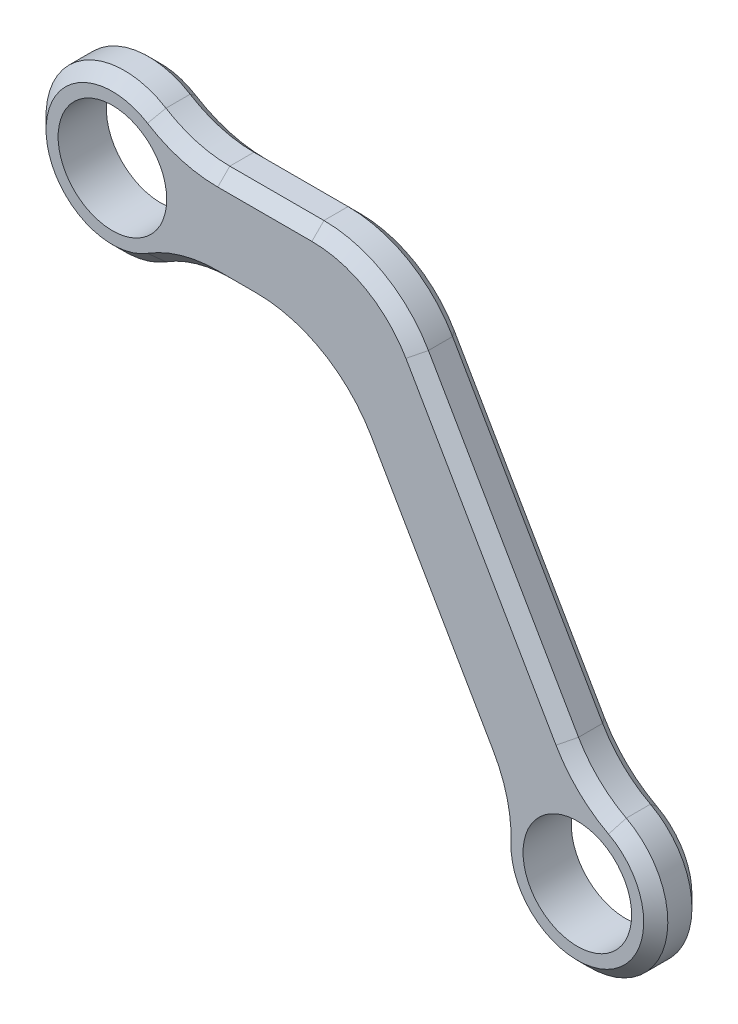
ISO-10303-21;
HEADER;
FILE_DESCRIPTION(('STEP AP214'),'2;1');
FILE_NAME('part.step','',(''),(''),'','','');
FILE_SCHEMA(('AUTOMOTIVE_DESIGN { 1 0 10303 214 1 1 1 1 }'));
ENDSEC;
DATA;
#1=APPLICATION_CONTEXT('core data for automotive mechanical design processes');
#2=APPLICATION_PROTOCOL_DEFINITION('international standard','automotive_design',2000,#1);
#3=PRODUCT_CONTEXT('',#1,'mechanical');
#4=PRODUCT('Part','Part','',(#3));
#5=PRODUCT_RELATED_PRODUCT_CATEGORY('part','',(#4));
#6=PRODUCT_DEFINITION_FORMATION('','',#4);
#7=PRODUCT_DEFINITION_CONTEXT('part definition',#1,'design');
#8=PRODUCT_DEFINITION('design','',#6,#7);
#9=PRODUCT_DEFINITION_SHAPE('','',#8);
#10=(LENGTH_UNIT() NAMED_UNIT(*) SI_UNIT(.MILLI.,.METRE.));
#11=(NAMED_UNIT(*) PLANE_ANGLE_UNIT() SI_UNIT($,.RADIAN.));
#12=(NAMED_UNIT(*) SI_UNIT($,.STERADIAN.) SOLID_ANGLE_UNIT());
#13=UNCERTAINTY_MEASURE_WITH_UNIT(LENGTH_MEASURE(1.E-05),#10,'distance_accuracy_value','');
#14=(GEOMETRIC_REPRESENTATION_CONTEXT(3) GLOBAL_UNCERTAINTY_ASSIGNED_CONTEXT((#13)) GLOBAL_UNIT_ASSIGNED_CONTEXT((#10,
#11,#12)) REPRESENTATION_CONTEXT('',''));
#15=CARTESIAN_POINT('',(0.,0.,0.));
#16=DIRECTION('',(0.,0.,1.));
#17=DIRECTION('',(1.,0.,0.));
#18=AXIS2_PLACEMENT_3D('',#15,#16,#17);
#19=CARTESIAN_POINT('',(38.5373405464593,-32.1076156636743,-4.));
#20=DIRECTION('',(0.,0.,-1.));
#21=DIRECTION('',(1.,0.,0.));
#22=AXIS2_PLACEMENT_3D('',#19,#20,#21);
#23=PLANE('',#22);
#24=CARTESIAN_POINT('',(38.5373405464593,-32.1076156636743,-4.));
#25=DIRECTION('',(0.,0.,1.));
#26=DIRECTION('',(1.,0.,0.));
#27=AXIS2_PLACEMENT_3D('',#24,#25,#26);
#28=CIRCLE('',#27,5.5);
#29=CARTESIAN_POINT('',(33.0405345624175,-31.9202017532986,-4.));
#30=VERTEX_POINT('',#29);
#31=CARTESIAN_POINT('',(41.1234383310723,-27.2535350866319,-4.));
#32=VERTEX_POINT('',#31);
#33=EDGE_CURVE('E54',#30,#32,#28,.T.);
#34=ORIENTED_EDGE('',*,*,#33,.F.);
#35=CARTESIAN_POINT('',(22.0469225943339,-31.5453739325472,-4.));
#36=DIRECTION('',(0.,0.,1.));
#37=DIRECTION('',(1.,0.,0.));
#38=AXIS2_PLACEMENT_3D('',#35,#36,#37);
#39=CIRCLE('',#38,11.);
#40=CARTESIAN_POINT('',(31.5732020359628,-26.0453739325472,-4.));
#41=VERTEX_POINT('',#40);
#42=EDGE_CURVE('E388',#41,#30,#39,.F.);
#43=ORIENTED_EDGE('',*,*,#42,.F.);
#44=DIRECTION('',(0.499999999999998,-0.86602540378444,0.));
#45=VECTOR('',#44,1.);
#46=CARTESIAN_POINT('',(31.5732020359628,-26.0453739325472,-4.));
#47=LINE('',#46,#45);
#48=CARTESIAN_POINT('',(21.4433756729741,-8.50000000000002,-4.));
#49=VERTEX_POINT('',#48);
#50=EDGE_CURVE('E385',#49,#41,#47,.T.);
#51=ORIENTED_EDGE('',*,*,#50,.F.);
#52=CARTESIAN_POINT('',(11.9170962313452,-14.,-4.));
#53=DIRECTION('',(0.,0.,1.));
#54=DIRECTION('',(1.,0.,0.));
#55=AXIS2_PLACEMENT_3D('',#52,#53,#54);
#56=CIRCLE('',#55,11.);
#57=CARTESIAN_POINT('',(11.9170962313452,-3.,-4.));
#58=VERTEX_POINT('',#57);
#59=EDGE_CURVE('E382',#58,#49,#56,.F.);
#60=ORIENTED_EDGE('',*,*,#59,.F.);
#61=DIRECTION('',(1.,0.,0.));
#62=VECTOR('',#61,1.);
#63=CARTESIAN_POINT('',(11.9170962313452,-3.,-4.));
#64=LINE('',#63,#62);
#65=CARTESIAN_POINT('',(8.73212459828649,-3.,-4.));
#66=VERTEX_POINT('',#65);
#67=EDGE_CURVE('E379',#66,#58,#64,.T.);
#68=ORIENTED_EDGE('',*,*,#67,.F.);
#69=CARTESIAN_POINT('',(8.73212459828649,-14.,-4.));
#70=DIRECTION('',(0.,0.,1.));
#71=DIRECTION('',(1.,0.,0.));
#72=AXIS2_PLACEMENT_3D('',#69,#70,#71);
#73=CIRCLE('',#72,11.);
#74=CARTESIAN_POINT('',(2.91070819942883,-4.66666666666667,-4.));
#75=VERTEX_POINT('',#74);
#76=EDGE_CURVE('E376',#75,#66,#73,.F.);
#77=ORIENTED_EDGE('',*,*,#76,.F.);
#78=CARTESIAN_POINT('',(0.,0.,-4.));
#79=DIRECTION('',(0.,0.,1.));
#80=DIRECTION('',(1.,0.,0.));
#81=AXIS2_PLACEMENT_3D('',#78,#79,#80);
#82=CIRCLE('',#81,5.5);
#83=CARTESIAN_POINT('',(2.91070819942883,4.66666666666667,-4.));
#84=VERTEX_POINT('',#83);
#85=EDGE_CURVE('E373',#84,#75,#82,.T.);
#86=ORIENTED_EDGE('',*,*,#85,.F.);
#87=CARTESIAN_POINT('',(8.73212459828649,14.,-4.));
#88=DIRECTION('',(0.,0.,1.));
#89=DIRECTION('',(1.,0.,0.));
#90=AXIS2_PLACEMENT_3D('',#87,#88,#89);
#91=CIRCLE('',#90,11.);
#92=CARTESIAN_POINT('',(8.73212459828649,3.,-4.));
#93=VERTEX_POINT('',#92);
#94=EDGE_CURVE('E370',#93,#84,#91,.F.);
#95=ORIENTED_EDGE('',*,*,#94,.F.);
#96=DIRECTION('',(-1.,0.,0.));
#97=VECTOR('',#96,1.);
#98=CARTESIAN_POINT('',(8.73212459828649,3.,-4.));
#99=LINE('',#98,#97);
#100=CARTESIAN_POINT('',(16.5358983848622,3.,-4.));
#101=VERTEX_POINT('',#100);
#102=EDGE_CURVE('E368',#101,#93,#99,.T.);
#103=ORIENTED_EDGE('',*,*,#102,.F.);
#104=CARTESIAN_POINT('',(16.5358983848622,-6.,-4.));
#105=DIRECTION('',(0.,0.,1.));
#106=DIRECTION('',(1.,0.,0.));
#107=AXIS2_PLACEMENT_3D('',#104,#105,#106);
#108=CIRCLE('',#107,9.);
#109=CARTESIAN_POINT('',(24.3301270189222,-1.50000000000002,-4.));
#110=VERTEX_POINT('',#109);
#111=EDGE_CURVE('E215',#110,#101,#108,.T.);
#112=ORIENTED_EDGE('',*,*,#111,.F.);
#113=DIRECTION('',(-0.499999999999998,0.86602540378444,0.));
#114=VECTOR('',#113,1.);
#115=CARTESIAN_POINT('',(24.3301270189222,-1.50000000000002,-4.));
#116=LINE('',#115,#114);
#117=CARTESIAN_POINT('',(36.7693544586694,-23.0453739325472,-4.));
#118=VERTEX_POINT('',#117);
#119=EDGE_CURVE('E364',#118,#110,#116,.T.);
#120=ORIENTED_EDGE('',*,*,#119,.F.);
#121=CARTESIAN_POINT('',(46.2956339002982,-17.5453739325472,-4.));
#122=DIRECTION('',(0.,0.,1.));
#123=DIRECTION('',(1.,0.,0.));
#124=AXIS2_PLACEMENT_3D('',#121,#122,#123);
#125=CIRCLE('',#124,11.);
#126=EDGE_CURVE('E11',#32,#118,#125,.F.);
#127=ORIENTED_EDGE('',*,*,#126,.F.);
#128=EDGE_LOOP('',(#34,#43,#51,#60,#68,#77,#86,#95,#103,#112,#120,#127));
#129=FACE_BOUND('',#128,.T.);
#130=CARTESIAN_POINT('',(0.,0.,-4.));
#131=DIRECTION('',(0.,0.,1.));
#132=DIRECTION('',(1.,0.,0.));
#133=AXIS2_PLACEMENT_3D('',#130,#131,#132);
#134=CIRCLE('',#133,4.5);
#135=CARTESIAN_POINT('',(4.5,0.,-4.));
#136=VERTEX_POINT('',#135);
#137=EDGE_CURVE('E458',#136,#136,#134,.T.);
#138=ORIENTED_EDGE('',*,*,#137,.T.);
#139=EDGE_LOOP('',(#138));
#140=FACE_BOUND('',#139,.T.);
#141=CARTESIAN_POINT('',(38.5373405464593,-32.1076156636743,-4.));
#142=DIRECTION('',(0.,0.,1.));
#143=DIRECTION('',(1.,0.,0.));
#144=AXIS2_PLACEMENT_3D('',#141,#142,#143);
#145=CIRCLE('',#144,4.5);
#146=CARTESIAN_POINT('',(43.0373405464593,-32.1076156636743,-4.));
#147=VERTEX_POINT('',#146);
#148=EDGE_CURVE('E462',#147,#147,#145,.T.);
#149=ORIENTED_EDGE('',*,*,#148,.T.);
#150=EDGE_LOOP('',(#149));
#151=FACE_BOUND('',#150,.T.);
#152=ADVANCED_FACE('F45',(#129,#140,#151),#23,.T.);
#153=CARTESIAN_POINT('',(38.5373405464593,-32.1076156636743,0.));
#154=DIRECTION('',(0.,0.,-1.));
#155=DIRECTION('',(1.,0.,0.));
#156=AXIS2_PLACEMENT_3D('',#153,#154,#155);
#157=PLANE('',#156);
#158=CARTESIAN_POINT('',(8.73212459828649,14.,0.));
#159=DIRECTION('',(0.,0.,1.));
#160=DIRECTION('',(1.,0.,0.));
#161=AXIS2_PLACEMENT_3D('',#158,#159,#160);
#162=CIRCLE('',#161,11.);
#163=CARTESIAN_POINT('',(2.91070819942883,4.66666666666666,0.));
#164=VERTEX_POINT('',#163);
#165=CARTESIAN_POINT('',(8.73212459828649,3.,0.));
#166=VERTEX_POINT('',#165);
#167=EDGE_CURVE('E300',#164,#166,#162,.T.);
#168=ORIENTED_EDGE('',*,*,#167,.F.);
#169=CARTESIAN_POINT('',(0.,0.,0.));
#170=DIRECTION('',(0.,0.,1.));
#171=DIRECTION('',(1.,0.,0.));
#172=AXIS2_PLACEMENT_3D('',#169,#170,#171);
#173=CIRCLE('',#172,5.5);
#174=CARTESIAN_POINT('',(2.91070819942883,-4.66666666666667,0.));
#175=VERTEX_POINT('',#174);
#176=EDGE_CURVE('E297',#175,#164,#173,.F.);
#177=ORIENTED_EDGE('',*,*,#176,.F.);
#178=CARTESIAN_POINT('',(8.73212459828649,-14.,0.));
#179=DIRECTION('',(0.,0.,1.));
#180=DIRECTION('',(1.,0.,0.));
#181=AXIS2_PLACEMENT_3D('',#178,#179,#180);
#182=CIRCLE('',#181,11.);
#183=CARTESIAN_POINT('',(8.73212459828649,-3.,0.));
#184=VERTEX_POINT('',#183);
#185=EDGE_CURVE('E294',#184,#175,#182,.T.);
#186=ORIENTED_EDGE('',*,*,#185,.F.);
#187=DIRECTION('',(-1.,0.,0.));
#188=VECTOR('',#187,1.);
#189=CARTESIAN_POINT('',(38.5373405464593,-3.,0.));
#190=LINE('',#189,#188);
#191=CARTESIAN_POINT('',(11.9170962313452,-3.,0.));
#192=VERTEX_POINT('',#191);
#193=EDGE_CURVE('E291',#192,#184,#190,.T.);
#194=ORIENTED_EDGE('',*,*,#193,.F.);
#195=CARTESIAN_POINT('',(11.9170962313452,-14.,0.));
#196=DIRECTION('',(0.,0.,1.));
#197=DIRECTION('',(1.,0.,0.));
#198=AXIS2_PLACEMENT_3D('',#195,#196,#197);
#199=CIRCLE('',#198,11.);
#200=CARTESIAN_POINT('',(21.4433756729741,-8.50000000000002,0.));
#201=VERTEX_POINT('',#200);
#202=EDGE_CURVE('E288',#201,#192,#199,.T.);
#203=ORIENTED_EDGE('',*,*,#202,.F.);
#204=DIRECTION('',(-0.499999999999998,0.86602540378444,0.));
#205=VECTOR('',#204,1.);
#206=CARTESIAN_POINT('',(35.939264335106,-33.6076156636743,0.));
#207=LINE('',#206,#205);
#208=CARTESIAN_POINT('',(31.5732020359628,-26.0453739325472,0.));
#209=VERTEX_POINT('',#208);
#210=EDGE_CURVE('E285',#209,#201,#207,.T.);
#211=ORIENTED_EDGE('',*,*,#210,.F.);
#212=CARTESIAN_POINT('',(22.0469225943339,-31.5453739325472,0.));
#213=DIRECTION('',(0.,0.,1.));
#214=DIRECTION('',(1.,0.,0.));
#215=AXIS2_PLACEMENT_3D('',#212,#213,#214);
#216=CIRCLE('',#215,11.);
#217=CARTESIAN_POINT('',(33.0405345624175,-31.9202017532986,0.));
#218=VERTEX_POINT('',#217);
#219=EDGE_CURVE('E282',#218,#209,#216,.T.);
#220=ORIENTED_EDGE('',*,*,#219,.F.);
#221=CARTESIAN_POINT('',(38.5373405464593,-32.1076156636743,0.));
#222=DIRECTION('',(0.,0.,1.));
#223=DIRECTION('',(1.,0.,0.));
#224=AXIS2_PLACEMENT_3D('',#221,#222,#223);
#225=CIRCLE('',#224,5.5);
#226=CARTESIAN_POINT('',(41.1234383310723,-27.2535350866319,0.));
#227=VERTEX_POINT('',#226);
#228=EDGE_CURVE('E279',#227,#218,#225,.F.);
#229=ORIENTED_EDGE('',*,*,#228,.F.);
#230=CARTESIAN_POINT('',(46.2956339002982,-17.5453739325472,0.));
#231=DIRECTION('',(0.,0.,1.));
#232=DIRECTION('',(1.,0.,0.));
#233=AXIS2_PLACEMENT_3D('',#230,#231,#232);
#234=CIRCLE('',#233,11.);
#235=CARTESIAN_POINT('',(36.7693544586694,-23.0453739325472,0.));
#236=VERTEX_POINT('',#235);
#237=EDGE_CURVE('E276',#236,#227,#234,.T.);
#238=ORIENTED_EDGE('',*,*,#237,.F.);
#239=DIRECTION('',(0.499999999999998,-0.86602540378444,0.));
#240=VECTOR('',#239,1.);
#241=CARTESIAN_POINT('',(41.1354167578126,-30.6076156636743,0.));
#242=LINE('',#241,#240);
#243=CARTESIAN_POINT('',(24.3301270189222,-1.50000000000002,0.));
#244=VERTEX_POINT('',#243);
#245=EDGE_CURVE('E273',#244,#236,#242,.T.);
#246=ORIENTED_EDGE('',*,*,#245,.F.);
#247=CARTESIAN_POINT('',(16.5358983848622,-6.,0.));
#248=DIRECTION('',(0.,0.,1.));
#249=DIRECTION('',(1.,0.,0.));
#250=AXIS2_PLACEMENT_3D('',#247,#248,#249);
#251=CIRCLE('',#250,9.);
#252=CARTESIAN_POINT('',(16.5358983848622,3.,0.));
#253=VERTEX_POINT('',#252);
#254=EDGE_CURVE('E270',#253,#244,#251,.F.);
#255=ORIENTED_EDGE('',*,*,#254,.F.);
#256=DIRECTION('',(1.,0.,0.));
#257=VECTOR('',#256,1.);
#258=CARTESIAN_POINT('',(38.5373405464593,3.,0.));
#259=LINE('',#258,#257);
#260=EDGE_CURVE('E303',#166,#253,#259,.T.);
#261=ORIENTED_EDGE('',*,*,#260,.F.);
#262=EDGE_LOOP('',(#168,#177,#186,#194,#203,#211,#220,#229,#238,#246,#255,#261));
#263=FACE_BOUND('',#262,.T.);
#264=CARTESIAN_POINT('',(0.,0.,0.));
#265=DIRECTION('',(0.,0.,1.));
#266=DIRECTION('',(1.,0.,0.));
#267=AXIS2_PLACEMENT_3D('',#264,#265,#266);
#268=CIRCLE('',#267,4.5);
#269=CARTESIAN_POINT('',(4.5,0.,0.));
#270=VERTEX_POINT('',#269);
#271=EDGE_CURVE('E459',#270,#270,#268,.T.);
#272=ORIENTED_EDGE('',*,*,#271,.F.);
#273=EDGE_LOOP('',(#272));
#274=FACE_BOUND('',#273,.T.);
#275=CARTESIAN_POINT('',(38.5373405464593,-32.1076156636743,0.));
#276=DIRECTION('',(0.,0.,1.));
#277=DIRECTION('',(1.,0.,0.));
#278=AXIS2_PLACEMENT_3D('',#275,#276,#277);
#279=CIRCLE('',#278,4.5);
#280=CARTESIAN_POINT('',(43.0373405464593,-32.1076156636743,0.));
#281=VERTEX_POINT('',#280);
#282=EDGE_CURVE('E415',#281,#281,#279,.T.);
#283=ORIENTED_EDGE('',*,*,#282,.F.);
#284=EDGE_LOOP('',(#283));
#285=FACE_BOUND('',#284,.T.);
#286=ADVANCED_FACE('F479',(#263,#274,#285),#157,.F.);
#287=CARTESIAN_POINT('',(38.5373405464593,-32.1076156636743,-4.));
#288=DIRECTION('',(0.,0.,1.));
#289=DIRECTION('',(-1.,0.,0.));
#290=AXIS2_PLACEMENT_3D('',#287,#288,#289);
#291=CYLINDRICAL_SURFACE('',#290,6.5);
#292=DIRECTION('',(0.,0.,1.));
#293=VECTOR('',#292,1.);
#294=CARTESIAN_POINT('',(32.0411152925917,-31.8861264968666,-4.));
#295=LINE('',#294,#293);
#296=CARTESIAN_POINT('',(32.0411152925917,-31.8861264968666,-3.00000000000001));
#297=VERTEX_POINT('',#296);
#298=CARTESIAN_POINT('',(32.0411152925917,-31.8861264968666,-0.999999999999996));
#299=VERTEX_POINT('',#298);
#300=EDGE_CURVE('E261',#297,#299,#295,.T.);
#301=ORIENTED_EDGE('',*,*,#300,.F.);
#302=CARTESIAN_POINT('',(38.5373405464593,-32.1076156636743,-3.00000000000001));
#303=DIRECTION('',(0.,0.,1.));
#304=DIRECTION('',(1.,0.,0.));
#305=AXIS2_PLACEMENT_3D('',#302,#303,#304);
#306=CIRCLE('',#305,6.5);
#307=CARTESIAN_POINT('',(41.5936379282746,-26.3709749817151,-3.00000000000001));
#308=VERTEX_POINT('',#307);
#309=EDGE_CURVE('E347',#308,#297,#306,.F.);
#310=ORIENTED_EDGE('',*,*,#309,.F.);
#311=DIRECTION('',(0.,0.,1.));
#312=VECTOR('',#311,1.);
#313=CARTESIAN_POINT('',(41.5936379282746,-26.3709749817151,-4.));
#314=LINE('',#313,#312);
#315=CARTESIAN_POINT('',(41.5936379282746,-26.3709749817151,-0.999999999999996));
#316=VERTEX_POINT('',#315);
#317=EDGE_CURVE('E258',#316,#308,#314,.F.);
#318=ORIENTED_EDGE('',*,*,#317,.F.);
#319=CARTESIAN_POINT('',(38.5373405464593,-32.1076156636743,-0.999999999999996));
#320=DIRECTION('',(0.,0.,1.));
#321=DIRECTION('',(1.,0.,0.));
#322=AXIS2_PLACEMENT_3D('',#319,#320,#321);
#323=CIRCLE('',#322,6.5);
#324=EDGE_CURVE('E349',#299,#316,#323,.T.);
#325=ORIENTED_EDGE('',*,*,#324,.F.);
#326=EDGE_LOOP('',(#301,#310,#318,#325));
#327=FACE_BOUND('',#326,.T.);
#328=ADVANCED_FACE('F481',(#327),#291,.T.);
#329=CARTESIAN_POINT('',(22.3094010767585,4.,-4.));
#330=DIRECTION('',(-0.86602540378444,-0.499999999999998,0.));
#331=DIRECTION('',(0.499999999999998,-0.86602540378444,0.));
#332=AXIS2_PLACEMENT_3D('',#329,#330,#331);
#333=PLANE('',#332);
#334=DIRECTION('',(0.,0.,-1.));
#335=VECTOR('',#334,1.);
#336=CARTESIAN_POINT('',(37.6353798624538,-22.5453739325472,0.));
#337=LINE('',#336,#335);
#338=CARTESIAN_POINT('',(37.6353798624538,-22.5453739325472,-3.00000000000001));
#339=VERTEX_POINT('',#338);
#340=CARTESIAN_POINT('',(37.6353798624538,-22.5453739325472,-0.999999999999996));
#341=VERTEX_POINT('',#340);
#342=EDGE_CURVE('E247',#339,#341,#337,.F.);
#343=ORIENTED_EDGE('',*,*,#342,.F.);
#344=DIRECTION('',(0.499999999999998,-0.86602540378444,0.));
#345=VECTOR('',#344,1.);
#346=CARTESIAN_POINT('',(37.6353798624538,-22.5453739325472,-3.00000000000001));
#347=LINE('',#346,#345);
#348=CARTESIAN_POINT('',(25.1961524227066,-1.00000000000002,-3.00000000000001));
#349=VERTEX_POINT('',#348);
#350=EDGE_CURVE('E357',#349,#339,#347,.T.);
#351=ORIENTED_EDGE('',*,*,#350,.F.);
#352=DIRECTION('',(0.,0.,1.));
#353=VECTOR('',#352,1.);
#354=CARTESIAN_POINT('',(25.1961524227066,-1.00000000000002,-4.));
#355=LINE('',#354,#353);
#356=CARTESIAN_POINT('',(25.1961524227066,-1.00000000000002,-0.999999999999996));
#357=VERTEX_POINT('',#356);
#358=EDGE_CURVE('E229',#357,#349,#355,.F.);
#359=ORIENTED_EDGE('',*,*,#358,.F.);
#360=DIRECTION('',(-0.499999999999998,0.86602540378444,0.));
#361=VECTOR('',#360,1.);
#362=CARTESIAN_POINT('',(22.3094010767585,4.,-0.999999999999996));
#363=LINE('',#362,#361);
#364=EDGE_CURVE('E232',#341,#357,#363,.T.);
#365=ORIENTED_EDGE('',*,*,#364,.F.);
#366=EDGE_LOOP('',(#343,#351,#359,#365));
#367=FACE_BOUND('',#366,.T.);
#368=ADVANCED_FACE('F488',(#367),#333,.F.);
#369=CARTESIAN_POINT('',(5.1234753829798,4.,-4.));
#370=DIRECTION('',(0.,-1.,0.));
#371=DIRECTION('',(0.,0.,1.));
#372=AXIS2_PLACEMENT_3D('',#369,#370,#371);
#373=PLANE('',#372);
#374=DIRECTION('',(0.,0.,1.));
#375=VECTOR('',#374,1.);
#376=CARTESIAN_POINT('',(16.5358983848622,4.,-4.));
#377=LINE('',#376,#375);
#378=CARTESIAN_POINT('',(16.5358983848622,4.,-3.00000000000001));
#379=VERTEX_POINT('',#378);
#380=CARTESIAN_POINT('',(16.5358983848622,4.,-0.999999999999996));
#381=VERTEX_POINT('',#380);
#382=EDGE_CURVE('E227',#379,#381,#377,.T.);
#383=ORIENTED_EDGE('',*,*,#382,.F.);
#384=DIRECTION('',(1.,0.,0.));
#385=VECTOR('',#384,1.);
#386=CARTESIAN_POINT('',(16.5358983848622,4.,-3.00000000000001));
#387=LINE('',#386,#385);
#388=CARTESIAN_POINT('',(8.73212459828649,4.,-3.00000000000001));
#389=VERTEX_POINT('',#388);
#390=EDGE_CURVE('E235',#389,#379,#387,.T.);
#391=ORIENTED_EDGE('',*,*,#390,.F.);
#392=DIRECTION('',(0.,0.,-1.));
#393=VECTOR('',#392,1.);
#394=CARTESIAN_POINT('',(8.73212459828649,4.,-4.));
#395=LINE('',#394,#393);
#396=CARTESIAN_POINT('',(8.73212459828649,4.,-0.999999999999996));
#397=VERTEX_POINT('',#396);
#398=EDGE_CURVE('E248',#397,#389,#395,.T.);
#399=ORIENTED_EDGE('',*,*,#398,.F.);
#400=DIRECTION('',(-1.,0.,0.));
#401=VECTOR('',#400,1.);
#402=CARTESIAN_POINT('',(5.1234753829798,4.,-0.999999999999996));
#403=LINE('',#402,#401);
#404=EDGE_CURVE('E241',#381,#397,#403,.T.);
#405=ORIENTED_EDGE('',*,*,#404,.F.);
#406=EDGE_LOOP('',(#383,#391,#399,#405));
#407=FACE_BOUND('',#406,.T.);
#408=ADVANCED_FACE('F245',(#407),#373,.F.);
#409=CARTESIAN_POINT('',(0.,0.,-4.));
#410=DIRECTION('',(0.,0.,1.));
#411=DIRECTION('',(-1.,0.,0.));
#412=AXIS2_PLACEMENT_3D('',#409,#410,#411);
#413=CYLINDRICAL_SURFACE('',#412,6.5);
#414=DIRECTION('',(0.,0.,1.));
#415=VECTOR('',#414,1.);
#416=CARTESIAN_POINT('',(3.43992787205225,5.51515151515151,-4.));
#417=LINE('',#416,#415);
#418=CARTESIAN_POINT('',(3.43992787205225,5.51515151515151,-3.00000000000001));
#419=VERTEX_POINT('',#418);
#420=CARTESIAN_POINT('',(3.43992787205225,5.51515151515151,-0.999999999999996));
#421=VERTEX_POINT('',#420);
#422=EDGE_CURVE('E264',#419,#421,#417,.T.);
#423=ORIENTED_EDGE('',*,*,#422,.F.);
#424=CARTESIAN_POINT('',(0.,0.,-3.00000000000001));
#425=DIRECTION('',(0.,0.,1.));
#426=DIRECTION('',(1.,0.,0.));
#427=AXIS2_PLACEMENT_3D('',#424,#425,#426);
#428=CIRCLE('',#427,6.5);
#429=CARTESIAN_POINT('',(3.43992787205225,-5.51515151515151,-3.00000000000001));
#430=VERTEX_POINT('',#429);
#431=EDGE_CURVE('E311',#430,#419,#428,.F.);
#432=ORIENTED_EDGE('',*,*,#431,.F.);
#433=DIRECTION('',(0.,0.,1.));
#434=VECTOR('',#433,1.);
#435=CARTESIAN_POINT('',(3.43992787205225,-5.51515151515151,-4.));
#436=LINE('',#435,#434);
#437=CARTESIAN_POINT('',(3.43992787205225,-5.51515151515151,-0.999999999999996));
#438=VERTEX_POINT('',#437);
#439=EDGE_CURVE('E242',#438,#430,#436,.F.);
#440=ORIENTED_EDGE('',*,*,#439,.F.);
#441=CARTESIAN_POINT('',(0.,0.,-0.999999999999996));
#442=DIRECTION('',(0.,0.,1.));
#443=DIRECTION('',(1.,0.,0.));
#444=AXIS2_PLACEMENT_3D('',#441,#442,#443);
#445=CIRCLE('',#444,6.5);
#446=EDGE_CURVE('E314',#421,#438,#445,.T.);
#447=ORIENTED_EDGE('',*,*,#446,.F.);
#448=EDGE_LOOP('',(#423,#432,#440,#447));
#449=FACE_BOUND('',#448,.T.);
#450=ADVANCED_FACE('F503',(#449),#413,.T.);
#451=CARTESIAN_POINT('',(5.1234753829798,-4.,-4.));
#452=DIRECTION('',(0.,1.,0.));
#453=DIRECTION('',(0.,0.,-1.));
#454=AXIS2_PLACEMENT_3D('',#451,#452,#453);
#455=PLANE('',#454);
#456=DIRECTION('',(0.,0.,-1.));
#457=VECTOR('',#456,1.);
#458=CARTESIAN_POINT('',(8.73212459828649,-4.,0.));
#459=LINE('',#458,#457);
#460=CARTESIAN_POINT('',(8.73212459828649,-4.,-3.00000000000001));
#461=VERTEX_POINT('',#460);
#462=CARTESIAN_POINT('',(8.73212459828649,-4.,-0.999999999999996));
#463=VERTEX_POINT('',#462);
#464=EDGE_CURVE('E440',#461,#463,#459,.F.);
#465=ORIENTED_EDGE('',*,*,#464,.F.);
#466=DIRECTION('',(-1.,0.,0.));
#467=VECTOR('',#466,1.);
#468=CARTESIAN_POINT('',(8.73212459828649,-4.,-3.00000000000001));
#469=LINE('',#468,#467);
#470=CARTESIAN_POINT('',(11.9170962313452,-4.,-3.00000000000001));
#471=VERTEX_POINT('',#470);
#472=EDGE_CURVE('E323',#471,#461,#469,.T.);
#473=ORIENTED_EDGE('',*,*,#472,.F.);
#474=DIRECTION('',(0.,0.,1.));
#475=VECTOR('',#474,1.);
#476=CARTESIAN_POINT('',(11.9170962313452,-4.,-4.));
#477=LINE('',#476,#475);
#478=CARTESIAN_POINT('',(11.9170962313452,-4.,-0.999999999999996));
#479=VERTEX_POINT('',#478);
#480=EDGE_CURVE('E253',#479,#471,#477,.F.);
#481=ORIENTED_EDGE('',*,*,#480,.F.);
#482=DIRECTION('',(1.,0.,0.));
#483=VECTOR('',#482,1.);
#484=CARTESIAN_POINT('',(5.1234753829798,-4.,-0.999999999999996));
#485=LINE('',#484,#483);
#486=EDGE_CURVE('E326',#463,#479,#485,.T.);
#487=ORIENTED_EDGE('',*,*,#486,.F.);
#488=EDGE_LOOP('',(#465,#473,#481,#487));
#489=FACE_BOUND('',#488,.T.);
#490=ADVANCED_FACE('F448',(#489),#455,.F.);
#491=CARTESIAN_POINT('',(17.6905989232415,-4.,-4.));
#492=DIRECTION('',(0.86602540378444,0.499999999999998,0.));
#493=DIRECTION('',(-0.499999999999998,0.86602540378444,0.));
#494=AXIS2_PLACEMENT_3D('',#491,#492,#493);
#495=PLANE('',#494);
#496=DIRECTION('',(0.,0.,1.));
#497=VECTOR('',#496,1.);
#498=CARTESIAN_POINT('',(20.5773502691896,-9.00000000000002,0.));
#499=LINE('',#498,#497);
#500=CARTESIAN_POINT('',(20.5773502691896,-9.00000000000002,-3.00000000000001));
#501=VERTEX_POINT('',#500);
#502=CARTESIAN_POINT('',(20.5773502691896,-9.00000000000002,-0.999999999999993));
#503=VERTEX_POINT('',#502);
#504=EDGE_CURVE('E449',#501,#503,#499,.T.);
#505=ORIENTED_EDGE('',*,*,#504,.F.);
#506=DIRECTION('',(-0.499999999999998,0.86602540378444,0.));
#507=VECTOR('',#506,1.);
#508=CARTESIAN_POINT('',(20.5773502691896,-9.00000000000002,-3.00000000000001));
#509=LINE('',#508,#507);
#510=CARTESIAN_POINT('',(30.7071766321783,-26.5453739325472,-3.00000000000001));
#511=VERTEX_POINT('',#510);
#512=EDGE_CURVE('E335',#511,#501,#509,.T.);
#513=ORIENTED_EDGE('',*,*,#512,.F.);
#514=DIRECTION('',(0.,0.,-1.));
#515=VECTOR('',#514,1.);
#516=CARTESIAN_POINT('',(30.7071766321783,-26.5453739325472,-4.));
#517=LINE('',#516,#515);
#518=CARTESIAN_POINT('',(30.7071766321783,-26.5453739325472,-0.999999999999996));
#519=VERTEX_POINT('',#518);
#520=EDGE_CURVE('E453',#519,#511,#517,.T.);
#521=ORIENTED_EDGE('',*,*,#520,.F.);
#522=DIRECTION('',(0.499999999999998,-0.86602540378444,0.));
#523=VECTOR('',#522,1.);
#524=CARTESIAN_POINT('',(17.6905989232415,-4.,-0.999999999999993));
#525=LINE('',#524,#523);
#526=EDGE_CURVE('E338',#503,#519,#525,.T.);
#527=ORIENTED_EDGE('',*,*,#526,.F.);
#528=EDGE_LOOP('',(#505,#513,#521,#527));
#529=FACE_BOUND('',#528,.T.);
#530=ADVANCED_FACE('F497',(#529),#495,.F.);
#531=CARTESIAN_POINT('',(0.,0.,-4.));
#532=DIRECTION('',(0.,0.,1.));
#533=DIRECTION('',(-1.,0.,0.));
#534=AXIS2_PLACEMENT_3D('',#531,#532,#533);
#535=CYLINDRICAL_SURFACE('',#534,4.5);
#536=ORIENTED_EDGE('',*,*,#137,.F.);
#537=EDGE_LOOP('',(#536));
#538=FACE_BOUND('',#537,.T.);
#539=ORIENTED_EDGE('',*,*,#271,.T.);
#540=EDGE_LOOP('',(#539));
#541=FACE_BOUND('',#540,.T.);
#542=ADVANCED_FACE('F475',(#538,#541),#535,.F.);
#543=CARTESIAN_POINT('',(38.5373405464593,-32.1076156636743,-4.));
#544=DIRECTION('',(0.,0.,1.));
#545=DIRECTION('',(-1.,0.,0.));
#546=AXIS2_PLACEMENT_3D('',#543,#544,#545);
#547=CYLINDRICAL_SURFACE('',#546,4.5);
#548=ORIENTED_EDGE('',*,*,#148,.F.);
#549=EDGE_LOOP('',(#548));
#550=FACE_BOUND('',#549,.T.);
#551=ORIENTED_EDGE('',*,*,#282,.T.);
#552=EDGE_LOOP('',(#551));
#553=FACE_BOUND('',#552,.T.);
#554=ADVANCED_FACE('F471',(#550,#553),#547,.F.);
#555=CARTESIAN_POINT('',(11.9170962313452,-14.,-4.));
#556=DIRECTION('',(0.,0.,-1.));
#557=DIRECTION('',(1.,0.,0.));
#558=AXIS2_PLACEMENT_3D('',#555,#556,#557);
#559=CYLINDRICAL_SURFACE('',#558,10.);
#560=ORIENTED_EDGE('',*,*,#480,.T.);
#561=CARTESIAN_POINT('',(11.9170962313452,-14.,-3.00000000000001));
#562=DIRECTION('',(0.,0.,1.));
#563=DIRECTION('',(1.,0.,0.));
#564=AXIS2_PLACEMENT_3D('',#561,#562,#563);
#565=CIRCLE('',#564,10.);
#566=EDGE_CURVE('E329',#501,#471,#565,.T.);
#567=ORIENTED_EDGE('',*,*,#566,.F.);
#568=ORIENTED_EDGE('',*,*,#504,.T.);
#569=CARTESIAN_POINT('',(11.9170962313452,-14.,-0.999999999999996));
#570=DIRECTION('',(0.,0.,1.));
#571=DIRECTION('',(1.,0.,0.));
#572=AXIS2_PLACEMENT_3D('',#569,#570,#571);
#573=CIRCLE('',#572,10.);
#574=EDGE_CURVE('E332',#479,#503,#573,.F.);
#575=ORIENTED_EDGE('',*,*,#574,.F.);
#576=EDGE_LOOP('',(#560,#567,#568,#575));
#577=FACE_BOUND('',#576,.T.);
#578=ADVANCED_FACE('F474',(#577),#559,.F.);
#579=CARTESIAN_POINT('',(16.5358983848622,-6.,-4.));
#580=DIRECTION('',(0.,0.,1.));
#581=DIRECTION('',(-1.,0.,0.));
#582=AXIS2_PLACEMENT_3D('',#579,#580,#581);
#583=CYLINDRICAL_SURFACE('',#582,10.);
#584=ORIENTED_EDGE('',*,*,#358,.T.);
#585=CARTESIAN_POINT('',(16.5358983848622,-6.,-3.00000000000001));
#586=DIRECTION('',(0.,0.,1.));
#587=DIRECTION('',(1.,0.,0.));
#588=AXIS2_PLACEMENT_3D('',#585,#586,#587);
#589=CIRCLE('',#588,10.);
#590=EDGE_CURVE('E212',#379,#349,#589,.F.);
#591=ORIENTED_EDGE('',*,*,#590,.F.);
#592=ORIENTED_EDGE('',*,*,#382,.T.);
#593=CARTESIAN_POINT('',(16.5358983848622,-6.,-0.999999999999996));
#594=DIRECTION('',(0.,0.,1.));
#595=DIRECTION('',(1.,0.,0.));
#596=AXIS2_PLACEMENT_3D('',#593,#594,#595);
#597=CIRCLE('',#596,10.);
#598=EDGE_CURVE('E231',#357,#381,#597,.T.);
#599=ORIENTED_EDGE('',*,*,#598,.F.);
#600=EDGE_LOOP('',(#584,#591,#592,#599));
#601=FACE_BOUND('',#600,.T.);
#602=ADVANCED_FACE('F224',(#601),#583,.T.);
#603=CARTESIAN_POINT('',(22.0469225943339,-31.5453739325472,-4.));
#604=DIRECTION('',(0.,0.,1.));
#605=DIRECTION('',(-1.,0.,0.));
#606=AXIS2_PLACEMENT_3D('',#603,#604,#605);
#607=CYLINDRICAL_SURFACE('',#606,10.);
#608=ORIENTED_EDGE('',*,*,#520,.T.);
#609=CARTESIAN_POINT('',(22.0469225943339,-31.5453739325472,-3.00000000000001));
#610=DIRECTION('',(0.,0.,1.));
#611=DIRECTION('',(1.,0.,0.));
#612=AXIS2_PLACEMENT_3D('',#609,#610,#611);
#613=CIRCLE('',#612,10.);
#614=EDGE_CURVE('E341',#297,#511,#613,.T.);
#615=ORIENTED_EDGE('',*,*,#614,.F.);
#616=ORIENTED_EDGE('',*,*,#300,.T.);
#617=CARTESIAN_POINT('',(22.0469225943339,-31.5453739325472,-0.999999999999996));
#618=DIRECTION('',(0.,0.,1.));
#619=DIRECTION('',(1.,0.,0.));
#620=AXIS2_PLACEMENT_3D('',#617,#618,#619);
#621=CIRCLE('',#620,10.);
#622=EDGE_CURVE('E344',#519,#299,#621,.F.);
#623=ORIENTED_EDGE('',*,*,#622,.F.);
#624=EDGE_LOOP('',(#608,#615,#616,#623));
#625=FACE_BOUND('',#624,.T.);
#626=ADVANCED_FACE('F517',(#625),#607,.F.);
#627=CARTESIAN_POINT('',(46.2956339002982,-17.5453739325472,-4.));
#628=DIRECTION('',(0.,0.,1.));
#629=DIRECTION('',(-1.,0.,0.));
#630=AXIS2_PLACEMENT_3D('',#627,#628,#629);
#631=CYLINDRICAL_SURFACE('',#630,10.);
#632=ORIENTED_EDGE('',*,*,#317,.T.);
#633=CARTESIAN_POINT('',(46.2956339002982,-17.5453739325472,-3.00000000000001));
#634=DIRECTION('',(0.,0.,1.));
#635=DIRECTION('',(1.,0.,0.));
#636=AXIS2_PLACEMENT_3D('',#633,#634,#635);
#637=CIRCLE('',#636,10.);
#638=EDGE_CURVE('E352',#339,#308,#637,.T.);
#639=ORIENTED_EDGE('',*,*,#638,.F.);
#640=ORIENTED_EDGE('',*,*,#342,.T.);
#641=CARTESIAN_POINT('',(46.2956339002982,-17.5453739325472,-0.999999999999996));
#642=DIRECTION('',(0.,0.,1.));
#643=DIRECTION('',(1.,0.,0.));
#644=AXIS2_PLACEMENT_3D('',#641,#642,#643);
#645=CIRCLE('',#644,10.);
#646=EDGE_CURVE('E354',#316,#341,#645,.F.);
#647=ORIENTED_EDGE('',*,*,#646,.F.);
#648=EDGE_LOOP('',(#632,#639,#640,#647));
#649=FACE_BOUND('',#648,.T.);
#650=ADVANCED_FACE('F520',(#649),#631,.F.);
#651=CARTESIAN_POINT('',(8.73212459828649,-14.,-4.));
#652=DIRECTION('',(0.,0.,1.));
#653=DIRECTION('',(-1.,0.,0.));
#654=AXIS2_PLACEMENT_3D('',#651,#652,#653);
#655=CYLINDRICAL_SURFACE('',#654,10.);
#656=ORIENTED_EDGE('',*,*,#439,.T.);
#657=CARTESIAN_POINT('',(8.73212459828649,-14.,-3.00000000000001));
#658=DIRECTION('',(0.,0.,1.));
#659=DIRECTION('',(1.,0.,0.));
#660=AXIS2_PLACEMENT_3D('',#657,#658,#659);
#661=CIRCLE('',#660,10.);
#662=EDGE_CURVE('E317',#461,#430,#661,.T.);
#663=ORIENTED_EDGE('',*,*,#662,.F.);
#664=ORIENTED_EDGE('',*,*,#464,.T.);
#665=CARTESIAN_POINT('',(8.73212459828649,-14.,-0.999999999999996));
#666=DIRECTION('',(0.,0.,1.));
#667=DIRECTION('',(1.,0.,0.));
#668=AXIS2_PLACEMENT_3D('',#665,#666,#667);
#669=CIRCLE('',#668,10.);
#670=EDGE_CURVE('E320',#438,#463,#669,.F.);
#671=ORIENTED_EDGE('',*,*,#670,.F.);
#672=EDGE_LOOP('',(#656,#663,#664,#671));
#673=FACE_BOUND('',#672,.T.);
#674=ADVANCED_FACE('F437',(#673),#655,.F.);
#675=CARTESIAN_POINT('',(8.73212459828649,14.,-4.));
#676=DIRECTION('',(0.,0.,1.));
#677=DIRECTION('',(-1.,0.,0.));
#678=AXIS2_PLACEMENT_3D('',#675,#676,#677);
#679=CYLINDRICAL_SURFACE('',#678,10.);
#680=ORIENTED_EDGE('',*,*,#398,.T.);
#681=CARTESIAN_POINT('',(8.73212459828649,14.,-3.00000000000001));
#682=DIRECTION('',(0.,0.,1.));
#683=DIRECTION('',(1.,0.,0.));
#684=AXIS2_PLACEMENT_3D('',#681,#682,#683);
#685=CIRCLE('',#684,10.);
#686=EDGE_CURVE('E306',#419,#389,#685,.T.);
#687=ORIENTED_EDGE('',*,*,#686,.F.);
#688=ORIENTED_EDGE('',*,*,#422,.T.);
#689=CARTESIAN_POINT('',(8.73212459828649,14.,-0.999999999999996));
#690=DIRECTION('',(0.,0.,1.));
#691=DIRECTION('',(1.,0.,0.));
#692=AXIS2_PLACEMENT_3D('',#689,#690,#691);
#693=CIRCLE('',#692,10.);
#694=EDGE_CURVE('E308',#397,#421,#693,.F.);
#695=ORIENTED_EDGE('',*,*,#694,.F.);
#696=EDGE_LOOP('',(#680,#687,#688,#695));
#697=FACE_BOUND('',#696,.T.);
#698=ADVANCED_FACE('F527',(#697),#679,.F.);
#699=CARTESIAN_POINT('',(17.6905989232415,-4.,-0.999999999999996));
#700=DIRECTION('',(0.612372435695793,0.353553390593271,-0.707106781186551));
#701=DIRECTION('',(0.499999999999998,-0.86602540378444,0.));
#702=AXIS2_PLACEMENT_3D('',#699,#700,#701);
#703=PLANE('',#702);
#704=DIRECTION('',(-0.612372435695799,-0.353553390593274,-0.707106781186544));
#705=VECTOR('',#704,1.);
#706=CARTESIAN_POINT('',(21.4433756729741,-8.50000000000002,0.));
#707=LINE('',#706,#705);
#708=EDGE_CURVE('E411',#201,#503,#707,.T.);
#709=ORIENTED_EDGE('',*,*,#708,.T.);
#710=ORIENTED_EDGE('',*,*,#526,.T.);
#711=DIRECTION('',(0.612372435695798,0.353553390593275,0.707106781186544));
#712=VECTOR('',#711,1.);
#713=CARTESIAN_POINT('',(30.7071766321783,-26.5453739325472,-0.999999999999993));
#714=LINE('',#713,#712);
#715=EDGE_CURVE('E413',#519,#209,#714,.T.);
#716=ORIENTED_EDGE('',*,*,#715,.T.);
#717=ORIENTED_EDGE('',*,*,#210,.T.);
#718=EDGE_LOOP('',(#709,#710,#716,#717));
#719=FACE_BOUND('',#718,.T.);
#720=ADVANCED_FACE('F530',(#719),#703,.F.);
#721=CARTESIAN_POINT('',(22.0469225943339,-31.5453739325472,0.));
#722=DIRECTION('',(0.,0.,1.));
#723=DIRECTION('',(-1.,0.,0.));
#724=AXIS2_PLACEMENT_3D('',#721,#722,#723);
#725=CONICAL_SURFACE('',#724,11.,0.785398163397452);
#726=ORIENTED_EDGE('',*,*,#715,.F.);
#727=ORIENTED_EDGE('',*,*,#622,.T.);
#728=DIRECTION('',(0.706696142942319,-0.0240948448937,0.707106781186546));
#729=VECTOR('',#728,1.);
#730=CARTESIAN_POINT('',(32.0411152925917,-31.8861264968666,-0.999999999999996));
#731=LINE('',#730,#729);
#732=EDGE_CURVE('E409',#299,#218,#731,.T.);
#733=ORIENTED_EDGE('',*,*,#732,.T.);
#734=ORIENTED_EDGE('',*,*,#219,.T.);
#735=EDGE_LOOP('',(#726,#727,#733,#734));
#736=FACE_BOUND('',#735,.T.);
#737=ADVANCED_FACE('F571',(#736),#725,.F.);
#738=CARTESIAN_POINT('',(11.9170962313452,-14.,0.));
#739=DIRECTION('',(0.,0.,1.));
#740=DIRECTION('',(-1.,0.,0.));
#741=AXIS2_PLACEMENT_3D('',#738,#739,#740);
#742=CONICAL_SURFACE('',#741,11.,0.785398163397451);
#743=ORIENTED_EDGE('',*,*,#708,.F.);
#744=ORIENTED_EDGE('',*,*,#202,.T.);
#745=DIRECTION('',(0.,-0.707106781186549,-0.707106781186546));
#746=VECTOR('',#745,1.);
#747=CARTESIAN_POINT('',(11.9170962313452,-3.,0.));
#748=LINE('',#747,#746);
#749=EDGE_CURVE('E407',#192,#479,#748,.T.);
#750=ORIENTED_EDGE('',*,*,#749,.T.);
#751=ORIENTED_EDGE('',*,*,#574,.T.);
#752=EDGE_LOOP('',(#743,#744,#750,#751));
#753=FACE_BOUND('',#752,.T.);
#754=ADVANCED_FACE('F567',(#753),#742,.F.);
#755=CARTESIAN_POINT('',(38.5373405464593,-32.1076156636743,-0.999999999999996));
#756=DIRECTION('',(0.,0.,-1.));
#757=DIRECTION('',(1.,0.,0.));
#758=AXIS2_PLACEMENT_3D('',#755,#756,#757);
#759=CONICAL_SURFACE('',#758,6.5,0.785398163397452);
#760=ORIENTED_EDGE('',*,*,#732,.F.);
#761=ORIENTED_EDGE('',*,*,#324,.T.);
#762=DIRECTION('',(-0.332481323692973,-0.624064234991377,0.707106781186545));
#763=VECTOR('',#762,1.);
#764=CARTESIAN_POINT('',(41.5936379282746,-26.3709749817151,-0.999999999999996));
#765=LINE('',#764,#763);
#766=EDGE_CURVE('E405',#316,#227,#765,.T.);
#767=ORIENTED_EDGE('',*,*,#766,.T.);
#768=ORIENTED_EDGE('',*,*,#228,.T.);
#769=EDGE_LOOP('',(#760,#761,#767,#768));
#770=FACE_BOUND('',#769,.T.);
#771=ADVANCED_FACE('F563',(#770),#759,.T.);
#772=CARTESIAN_POINT('',(5.1234753829798,-4.,-0.999999999999996));
#773=DIRECTION('',(0.,0.707106781186546,-0.707106781186549));
#774=DIRECTION('',(1.,0.,0.));
#775=AXIS2_PLACEMENT_3D('',#772,#773,#774);
#776=PLANE('',#775);
#777=ORIENTED_EDGE('',*,*,#749,.F.);
#778=ORIENTED_EDGE('',*,*,#193,.T.);
#779=DIRECTION('',(0.,-0.707106781186549,-0.707106781186546));
#780=VECTOR('',#779,1.);
#781=CARTESIAN_POINT('',(8.73212459828649,-3.,0.));
#782=LINE('',#781,#780);
#783=EDGE_CURVE('E403',#184,#463,#782,.T.);
#784=ORIENTED_EDGE('',*,*,#783,.T.);
#785=ORIENTED_EDGE('',*,*,#486,.T.);
#786=EDGE_LOOP('',(#777,#778,#784,#785));
#787=FACE_BOUND('',#786,.T.);
#788=ADVANCED_FACE('F559',(#787),#776,.F.);
#789=CARTESIAN_POINT('',(46.2956339002982,-17.5453739325472,0.));
#790=DIRECTION('',(0.,0.,1.));
#791=DIRECTION('',(-1.,0.,0.));
#792=AXIS2_PLACEMENT_3D('',#789,#790,#791);
#793=CONICAL_SURFACE('',#792,11.,0.785398163397454);
#794=ORIENTED_EDGE('',*,*,#766,.F.);
#795=ORIENTED_EDGE('',*,*,#646,.T.);
#796=DIRECTION('',(-0.612372435695798,-0.353553390593274,0.707106781186545));
#797=VECTOR('',#796,1.);
#798=CARTESIAN_POINT('',(37.6353798624538,-22.5453739325472,-0.999999999999995));
#799=LINE('',#798,#797);
#800=EDGE_CURVE('E401',#341,#236,#799,.T.);
#801=ORIENTED_EDGE('',*,*,#800,.T.);
#802=ORIENTED_EDGE('',*,*,#237,.T.);
#803=EDGE_LOOP('',(#794,#795,#801,#802));
#804=FACE_BOUND('',#803,.T.);
#805=ADVANCED_FACE('F555',(#804),#793,.F.);
#806=CARTESIAN_POINT('',(8.73212459828649,-14.,0.));
#807=DIRECTION('',(0.,0.,1.));
#808=DIRECTION('',(-1.,0.,0.));
#809=AXIS2_PLACEMENT_3D('',#806,#807,#808);
#810=CONICAL_SURFACE('',#809,11.,0.785398163397452);
#811=ORIENTED_EDGE('',*,*,#783,.F.);
#812=ORIENTED_EDGE('',*,*,#185,.T.);
#813=DIRECTION('',(0.374214819249349,-0.599969390097678,-0.707106781186546));
#814=VECTOR('',#813,1.);
#815=CARTESIAN_POINT('',(2.91070819942883,-4.66666666666667,0.));
#816=LINE('',#815,#814);
#817=EDGE_CURVE('E399',#175,#438,#816,.T.);
#818=ORIENTED_EDGE('',*,*,#817,.T.);
#819=ORIENTED_EDGE('',*,*,#670,.T.);
#820=EDGE_LOOP('',(#811,#812,#818,#819));
#821=FACE_BOUND('',#820,.T.);
#822=ADVANCED_FACE('F551',(#821),#810,.F.);
#823=CARTESIAN_POINT('',(22.3094010767585,4.,-0.999999999999996));
#824=DIRECTION('',(-0.612372435695794,-0.353553390593271,-0.707106781186549));
#825=DIRECTION('',(-0.499999999999998,0.86602540378444,0.));
#826=AXIS2_PLACEMENT_3D('',#823,#824,#825);
#827=PLANE('',#826);
#828=ORIENTED_EDGE('',*,*,#800,.F.);
#829=ORIENTED_EDGE('',*,*,#364,.T.);
#830=DIRECTION('',(-0.612372435695798,-0.353553390593273,0.707106781186545));
#831=VECTOR('',#830,1.);
#832=CARTESIAN_POINT('',(25.1961524227066,-1.00000000000002,-0.999999999999996));
#833=LINE('',#832,#831);
#834=EDGE_CURVE('E397',#357,#244,#833,.T.);
#835=ORIENTED_EDGE('',*,*,#834,.T.);
#836=ORIENTED_EDGE('',*,*,#245,.T.);
#837=EDGE_LOOP('',(#828,#829,#835,#836));
#838=FACE_BOUND('',#837,.T.);
#839=ADVANCED_FACE('F547',(#838),#827,.F.);
#840=CARTESIAN_POINT('',(0.,0.,-0.999999999999996));
#841=DIRECTION('',(0.,0.,-1.));
#842=DIRECTION('',(1.,0.,0.));
#843=AXIS2_PLACEMENT_3D('',#840,#841,#842);
#844=CONICAL_SURFACE('',#843,6.5,0.785398163397451);
#845=ORIENTED_EDGE('',*,*,#817,.F.);
#846=ORIENTED_EDGE('',*,*,#176,.T.);
#847=DIRECTION('',(0.374214819249349,0.599969390097679,-0.707106781186545));
#848=VECTOR('',#847,1.);
#849=CARTESIAN_POINT('',(2.91070819942883,4.66666666666666,0.));
#850=LINE('',#849,#848);
#851=EDGE_CURVE('E395',#164,#421,#850,.T.);
#852=ORIENTED_EDGE('',*,*,#851,.T.);
#853=ORIENTED_EDGE('',*,*,#446,.T.);
#854=EDGE_LOOP('',(#845,#846,#852,#853));
#855=FACE_BOUND('',#854,.T.);
#856=ADVANCED_FACE('F543',(#855),#844,.T.);
#857=CARTESIAN_POINT('',(16.5358983848622,-6.,0.));
#858=DIRECTION('',(0.,0.,-1.));
#859=DIRECTION('',(1.,0.,0.));
#860=AXIS2_PLACEMENT_3D('',#857,#858,#859);
#861=CONICAL_SURFACE('',#860,9.,0.785398163397452);
#862=ORIENTED_EDGE('',*,*,#834,.F.);
#863=ORIENTED_EDGE('',*,*,#598,.T.);
#864=DIRECTION('',(0.,-0.707106781186549,0.707106781186546));
#865=VECTOR('',#864,1.);
#866=CARTESIAN_POINT('',(16.5358983848622,4.,-0.999999999999996));
#867=LINE('',#866,#865);
#868=EDGE_CURVE('E393',#381,#253,#867,.T.);
#869=ORIENTED_EDGE('',*,*,#868,.T.);
#870=ORIENTED_EDGE('',*,*,#254,.T.);
#871=EDGE_LOOP('',(#862,#863,#869,#870));
#872=FACE_BOUND('',#871,.T.);
#873=ADVANCED_FACE('F539',(#872),#861,.T.);
#874=CARTESIAN_POINT('',(8.73212459828649,14.,0.));
#875=DIRECTION('',(0.,0.,1.));
#876=DIRECTION('',(-1.,0.,0.));
#877=AXIS2_PLACEMENT_3D('',#874,#875,#876);
#878=CONICAL_SURFACE('',#877,11.,0.785398163397452);
#879=ORIENTED_EDGE('',*,*,#851,.F.);
#880=ORIENTED_EDGE('',*,*,#167,.T.);
#881=DIRECTION('',(0.,0.70710678118655,-0.707106781186545));
#882=VECTOR('',#881,1.);
#883=CARTESIAN_POINT('',(8.73212459828649,3.,0.));
#884=LINE('',#883,#882);
#885=EDGE_CURVE('E391',#166,#397,#884,.T.);
#886=ORIENTED_EDGE('',*,*,#885,.T.);
#887=ORIENTED_EDGE('',*,*,#694,.T.);
#888=EDGE_LOOP('',(#879,#880,#886,#887));
#889=FACE_BOUND('',#888,.T.);
#890=ADVANCED_FACE('F535',(#889),#878,.F.);
#891=CARTESIAN_POINT('',(5.1234753829798,4.,-0.999999999999996));
#892=DIRECTION('',(0.,-0.707106781186544,-0.707106781186551));
#893=DIRECTION('',(-1.,0.,0.));
#894=AXIS2_PLACEMENT_3D('',#891,#892,#893);
#895=PLANE('',#894);
#896=ORIENTED_EDGE('',*,*,#868,.F.);
#897=ORIENTED_EDGE('',*,*,#404,.T.);
#898=ORIENTED_EDGE('',*,*,#885,.F.);
#899=ORIENTED_EDGE('',*,*,#260,.T.);
#900=EDGE_LOOP('',(#896,#897,#898,#899));
#901=FACE_BOUND('',#900,.T.);
#902=ADVANCED_FACE('F532',(#901),#895,.F.);
#903=CARTESIAN_POINT('',(8.73212459828649,-14.,-4.));
#904=DIRECTION('',(0.,0.,-1.));
#905=DIRECTION('',(1.,0.,0.));
#906=AXIS2_PLACEMENT_3D('',#903,#904,#905);
#907=CONICAL_SURFACE('',#906,11.,0.785398163397452);
#908=DIRECTION('',(-0.374214819249349,0.599969390097679,-0.707106781186545));
#909=VECTOR('',#908,1.);
#910=CARTESIAN_POINT('',(3.43992787205225,-5.51515151515151,-3.00000000000001));
#911=LINE('',#910,#909);
#912=EDGE_CURVE('E429',#430,#75,#911,.T.);
#913=ORIENTED_EDGE('',*,*,#912,.T.);
#914=ORIENTED_EDGE('',*,*,#76,.T.);
#915=DIRECTION('',(0.,-0.70710678118655,0.707106781186545));
#916=VECTOR('',#915,1.);
#917=CARTESIAN_POINT('',(8.73212459828649,-3.,-4.));
#918=LINE('',#917,#916);
#919=EDGE_CURVE('E49',#66,#461,#918,.T.);
#920=ORIENTED_EDGE('',*,*,#919,.T.);
#921=ORIENTED_EDGE('',*,*,#662,.T.);
#922=EDGE_LOOP('',(#913,#914,#920,#921));
#923=FACE_BOUND('',#922,.T.);
#924=ADVANCED_FACE('F47',(#923),#907,.F.);
#925=CARTESIAN_POINT('',(38.5373405464593,-3.,-4.));
#926=DIRECTION('',(0.,-0.707106781186545,-0.70710678118655));
#927=DIRECTION('',(-1.,0.,0.));
#928=AXIS2_PLACEMENT_3D('',#925,#926,#927);
#929=PLANE('',#928);
#930=ORIENTED_EDGE('',*,*,#919,.F.);
#931=ORIENTED_EDGE('',*,*,#67,.T.);
#932=DIRECTION('',(0.,-0.70710678118655,0.707106781186545));
#933=VECTOR('',#932,1.);
#934=CARTESIAN_POINT('',(11.9170962313452,-3.,-4.));
#935=LINE('',#934,#933);
#936=EDGE_CURVE('E428',#58,#471,#935,.T.);
#937=ORIENTED_EDGE('',*,*,#936,.T.);
#938=ORIENTED_EDGE('',*,*,#472,.T.);
#939=EDGE_LOOP('',(#930,#931,#937,#938));
#940=FACE_BOUND('',#939,.T.);
#941=ADVANCED_FACE('F444',(#940),#929,.T.);
#942=CARTESIAN_POINT('',(0.,0.,-4.));
#943=DIRECTION('',(0.,0.,1.));
#944=DIRECTION('',(-1.,0.,0.));
#945=AXIS2_PLACEMENT_3D('',#942,#943,#944);
#946=CONICAL_SURFACE('',#945,5.5,0.785398163397452);
#947=ORIENTED_EDGE('',*,*,#912,.F.);
#948=ORIENTED_EDGE('',*,*,#431,.T.);
#949=DIRECTION('',(-0.374214819249349,-0.599969390097679,-0.707106781186545));
#950=VECTOR('',#949,1.);
#951=CARTESIAN_POINT('',(3.43992787205225,5.51515151515151,-3.00000000000001));
#952=LINE('',#951,#950);
#953=EDGE_CURVE('E426',#419,#84,#952,.T.);
#954=ORIENTED_EDGE('',*,*,#953,.T.);
#955=ORIENTED_EDGE('',*,*,#85,.T.);
#956=EDGE_LOOP('',(#947,#948,#954,#955));
#957=FACE_BOUND('',#956,.T.);
#958=ADVANCED_FACE('F608',(#957),#946,.T.);
#959=CARTESIAN_POINT('',(11.9170962313452,-14.,-4.));
#960=DIRECTION('',(0.,0.,-1.));
#961=DIRECTION('',(1.,0.,0.));
#962=AXIS2_PLACEMENT_3D('',#959,#960,#961);
#963=CONICAL_SURFACE('',#962,11.,0.785398163397452);
#964=ORIENTED_EDGE('',*,*,#936,.F.);
#965=ORIENTED_EDGE('',*,*,#59,.T.);
#966=DIRECTION('',(-0.612372435695798,-0.353553390593275,0.707106781186544));
#967=VECTOR('',#966,1.);
#968=CARTESIAN_POINT('',(21.4433756729741,-8.50000000000002,-4.));
#969=LINE('',#968,#967);
#970=EDGE_CURVE('E424',#49,#501,#969,.T.);
#971=ORIENTED_EDGE('',*,*,#970,.T.);
#972=ORIENTED_EDGE('',*,*,#566,.T.);
#973=EDGE_LOOP('',(#964,#965,#971,#972));
#974=FACE_BOUND('',#973,.T.);
#975=ADVANCED_FACE('F604',(#974),#963,.F.);
#976=CARTESIAN_POINT('',(8.73212459828649,14.,-4.));
#977=DIRECTION('',(0.,0.,-1.));
#978=DIRECTION('',(1.,0.,0.));
#979=AXIS2_PLACEMENT_3D('',#976,#977,#978);
#980=CONICAL_SURFACE('',#979,11.,0.785398163397452);
#981=ORIENTED_EDGE('',*,*,#953,.F.);
#982=ORIENTED_EDGE('',*,*,#686,.T.);
#983=DIRECTION('',(0.,-0.70710678118655,-0.707106781186545));
#984=VECTOR('',#983,1.);
#985=CARTESIAN_POINT('',(8.73212459828649,4.,-3.00000000000001));
#986=LINE('',#985,#984);
#987=EDGE_CURVE('E237',#389,#93,#986,.T.);
#988=ORIENTED_EDGE('',*,*,#987,.T.);
#989=ORIENTED_EDGE('',*,*,#94,.T.);
#990=EDGE_LOOP('',(#981,#982,#988,#989));
#991=FACE_BOUND('',#990,.T.);
#992=ADVANCED_FACE('F600',(#991),#980,.F.);
#993=CARTESIAN_POINT('',(35.939264335106,-33.6076156636743,-4.));
#994=DIRECTION('',(-0.612372435695792,-0.353553390593271,-0.707106781186551));
#995=DIRECTION('',(-0.499999999999998,0.86602540378444,0.));
#996=AXIS2_PLACEMENT_3D('',#993,#994,#995);
#997=PLANE('',#996);
#998=ORIENTED_EDGE('',*,*,#970,.F.);
#999=ORIENTED_EDGE('',*,*,#50,.T.);
#1000=DIRECTION('',(-0.612372435695798,-0.353553390593271,0.707106781186545));
#1001=VECTOR('',#1000,1.);
#1002=CARTESIAN_POINT('',(31.5732020359628,-26.0453739325472,-4.));
#1003=LINE('',#1002,#1001);
#1004=EDGE_CURVE('E220',#41,#511,#1003,.T.);
#1005=ORIENTED_EDGE('',*,*,#1004,.T.);
#1006=ORIENTED_EDGE('',*,*,#512,.T.);
#1007=EDGE_LOOP('',(#998,#999,#1005,#1006));
#1008=FACE_BOUND('',#1007,.T.);
#1009=ADVANCED_FACE('F597',(#1008),#997,.T.);
#1010=CARTESIAN_POINT('',(38.5373405464593,3.,-4.));
#1011=DIRECTION('',(0.,0.707106781186544,-0.707106781186551));
#1012=DIRECTION('',(1.,0.,0.));
#1013=AXIS2_PLACEMENT_3D('',#1010,#1011,#1012);
#1014=PLANE('',#1013);
#1015=ORIENTED_EDGE('',*,*,#987,.F.);
#1016=ORIENTED_EDGE('',*,*,#390,.T.);
#1017=DIRECTION('',(0.,-0.707106781186551,-0.707106781186544));
#1018=VECTOR('',#1017,1.);
#1019=CARTESIAN_POINT('',(16.5358983848622,4.,-3.00000000000001));
#1020=LINE('',#1019,#1018);
#1021=EDGE_CURVE('E209',#379,#101,#1020,.T.);
#1022=ORIENTED_EDGE('',*,*,#1021,.T.);
#1023=ORIENTED_EDGE('',*,*,#102,.T.);
#1024=EDGE_LOOP('',(#1015,#1016,#1022,#1023));
#1025=FACE_BOUND('',#1024,.T.);
#1026=ADVANCED_FACE('F236',(#1025),#1014,.T.);
#1027=CARTESIAN_POINT('',(22.0469225943339,-31.5453739325472,-4.));
#1028=DIRECTION('',(0.,0.,-1.));
#1029=DIRECTION('',(1.,0.,0.));
#1030=AXIS2_PLACEMENT_3D('',#1027,#1028,#1029);
#1031=CONICAL_SURFACE('',#1030,11.,0.785398163397453);
#1032=ORIENTED_EDGE('',*,*,#1004,.F.);
#1033=ORIENTED_EDGE('',*,*,#42,.T.);
#1034=DIRECTION('',(-0.70669614294232,0.0240948448937,0.707106781186545));
#1035=VECTOR('',#1034,1.);
#1036=CARTESIAN_POINT('',(33.0405345624175,-31.9202017532986,-4.));
#1037=LINE('',#1036,#1035);
#1038=EDGE_CURVE('E69',#30,#297,#1037,.T.);
#1039=ORIENTED_EDGE('',*,*,#1038,.T.);
#1040=ORIENTED_EDGE('',*,*,#614,.T.);
#1041=EDGE_LOOP('',(#1032,#1033,#1039,#1040));
#1042=FACE_BOUND('',#1041,.T.);
#1043=ADVANCED_FACE('F591',(#1042),#1031,.F.);
#1044=CARTESIAN_POINT('',(16.5358983848622,-6.,-4.));
#1045=DIRECTION('',(0.,0.,1.));
#1046=DIRECTION('',(-1.,0.,0.));
#1047=AXIS2_PLACEMENT_3D('',#1044,#1045,#1046);
#1048=CONICAL_SURFACE('',#1047,9.,0.785398163397453);
#1049=ORIENTED_EDGE('',*,*,#1021,.F.);
#1050=ORIENTED_EDGE('',*,*,#590,.T.);
#1051=DIRECTION('',(-0.612372435695798,-0.353553390593273,-0.707106781186544));
#1052=VECTOR('',#1051,1.);
#1053=CARTESIAN_POINT('',(25.1961524227066,-1.00000000000002,-3.00000000000001));
#1054=LINE('',#1053,#1052);
#1055=EDGE_CURVE('E419',#349,#110,#1054,.T.);
#1056=ORIENTED_EDGE('',*,*,#1055,.T.);
#1057=ORIENTED_EDGE('',*,*,#111,.T.);
#1058=EDGE_LOOP('',(#1049,#1050,#1056,#1057));
#1059=FACE_BOUND('',#1058,.T.);
#1060=ADVANCED_FACE('F211',(#1059),#1048,.T.);
#1061=CARTESIAN_POINT('',(38.5373405464593,-32.1076156636743,-4.));
#1062=DIRECTION('',(0.,0.,1.));
#1063=DIRECTION('',(-1.,0.,0.));
#1064=AXIS2_PLACEMENT_3D('',#1061,#1062,#1063);
#1065=CONICAL_SURFACE('',#1064,5.5,0.785398163397451);
#1066=ORIENTED_EDGE('',*,*,#1038,.F.);
#1067=ORIENTED_EDGE('',*,*,#33,.T.);
#1068=DIRECTION('',(0.332481323692974,0.624064234991376,0.707106781186545));
#1069=VECTOR('',#1068,1.);
#1070=CARTESIAN_POINT('',(41.1234383310723,-27.2535350866319,-4.));
#1071=LINE('',#1070,#1069);
#1072=EDGE_CURVE('E61',#32,#308,#1071,.T.);
#1073=ORIENTED_EDGE('',*,*,#1072,.T.);
#1074=ORIENTED_EDGE('',*,*,#309,.T.);
#1075=EDGE_LOOP('',(#1066,#1067,#1073,#1074));
#1076=FACE_BOUND('',#1075,.T.);
#1077=ADVANCED_FACE('F585',(#1076),#1065,.T.);
#1078=CARTESIAN_POINT('',(41.1354167578126,-30.6076156636743,-4.));
#1079=DIRECTION('',(0.612372435695794,0.353553390593272,-0.707106781186549));
#1080=DIRECTION('',(0.499999999999998,-0.86602540378444,0.));
#1081=AXIS2_PLACEMENT_3D('',#1078,#1079,#1080);
#1082=PLANE('',#1081);
#1083=ORIENTED_EDGE('',*,*,#1055,.F.);
#1084=ORIENTED_EDGE('',*,*,#350,.T.);
#1085=DIRECTION('',(-0.612372435695797,-0.353553390593272,-0.707106781186546));
#1086=VECTOR('',#1085,1.);
#1087=CARTESIAN_POINT('',(37.6353798624538,-22.5453739325472,-3.00000000000001));
#1088=LINE('',#1087,#1086);
#1089=EDGE_CURVE('E416',#339,#118,#1088,.T.);
#1090=ORIENTED_EDGE('',*,*,#1089,.T.);
#1091=ORIENTED_EDGE('',*,*,#119,.T.);
#1092=EDGE_LOOP('',(#1083,#1084,#1090,#1091));
#1093=FACE_BOUND('',#1092,.T.);
#1094=ADVANCED_FACE('F582',(#1093),#1082,.T.);
#1095=CARTESIAN_POINT('',(46.2956339002982,-17.5453739325472,-4.));
#1096=DIRECTION('',(0.,0.,-1.));
#1097=DIRECTION('',(1.,0.,0.));
#1098=AXIS2_PLACEMENT_3D('',#1095,#1096,#1097);
#1099=CONICAL_SURFACE('',#1098,11.,0.785398163397453);
#1100=ORIENTED_EDGE('',*,*,#1072,.F.);
#1101=ORIENTED_EDGE('',*,*,#126,.T.);
#1102=ORIENTED_EDGE('',*,*,#1089,.F.);
#1103=ORIENTED_EDGE('',*,*,#638,.T.);
#1104=EDGE_LOOP('',(#1100,#1101,#1102,#1103));
#1105=FACE_BOUND('',#1104,.T.);
#1106=ADVANCED_FACE('F579',(#1105),#1099,.F.);
#1107=CLOSED_SHELL('',(#152,#286,#328,#368,#408,#450,#490,#530,#542,#554,#578,#602,#626,#650,
#674,#698,#720,#737,#754,#771,#788,#805,#822,#839,#856,#873,#890,#902,#924,#941,#958,#975,#992,
#1009,#1026,#1043,#1060,#1077,#1094,#1106));
#1108=MANIFOLD_SOLID_BREP('B2',#1107);
#1109=ADVANCED_BREP_SHAPE_REPRESENTATION('',(#18,#1108),#14);
#1110=SHAPE_DEFINITION_REPRESENTATION(#9,#1109);
ENDSEC;
END-ISO-10303-21;
